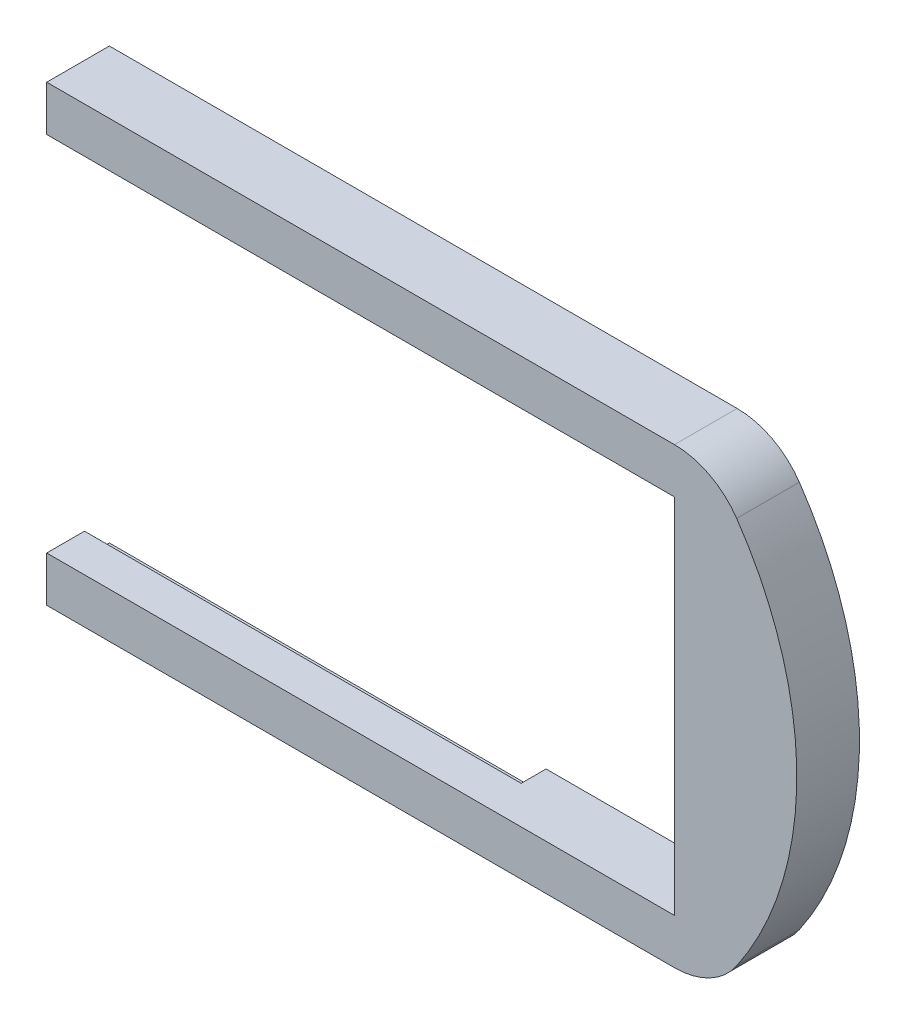
ISO-10303-21;
HEADER;
FILE_DESCRIPTION(('STEP AP214'),'2;1');
FILE_NAME('part.step','',(''),(''),'','','');
FILE_SCHEMA(('AUTOMOTIVE_DESIGN { 1 0 10303 214 1 1 1 1 }'));
ENDSEC;
DATA;
#1=APPLICATION_CONTEXT('core data for automotive mechanical design processes');
#2=APPLICATION_PROTOCOL_DEFINITION('international standard','automotive_design',2000,#1);
#3=PRODUCT_CONTEXT('',#1,'mechanical');
#4=PRODUCT('Part','Part','',(#3));
#5=PRODUCT_RELATED_PRODUCT_CATEGORY('part','',(#4));
#6=PRODUCT_DEFINITION_FORMATION('','',#4);
#7=PRODUCT_DEFINITION_CONTEXT('part definition',#1,'design');
#8=PRODUCT_DEFINITION('design','',#6,#7);
#9=PRODUCT_DEFINITION_SHAPE('','',#8);
#10=(LENGTH_UNIT() NAMED_UNIT(*) SI_UNIT(.MILLI.,.METRE.));
#11=(NAMED_UNIT(*) PLANE_ANGLE_UNIT() SI_UNIT($,.RADIAN.));
#12=(NAMED_UNIT(*) SI_UNIT($,.STERADIAN.) SOLID_ANGLE_UNIT());
#13=UNCERTAINTY_MEASURE_WITH_UNIT(LENGTH_MEASURE(1.E-05),#10,'distance_accuracy_value','');
#14=(GEOMETRIC_REPRESENTATION_CONTEXT(3) GLOBAL_UNCERTAINTY_ASSIGNED_CONTEXT((#13)) GLOBAL_UNIT_ASSIGNED_CONTEXT((#10,
#11,#12)) REPRESENTATION_CONTEXT('',''));
#15=CARTESIAN_POINT('',(0.,0.,0.));
#16=DIRECTION('',(0.,0.,1.));
#17=DIRECTION('',(1.,0.,0.));
#18=AXIS2_PLACEMENT_3D('',#15,#16,#17);
#19=CARTESIAN_POINT('',(33.9677102210414,-19.5410401503121,3.3));
#20=DIRECTION('',(0.,0.,-1.));
#21=DIRECTION('',(-1.,0.,0.));
#22=AXIS2_PLACEMENT_3D('',#19,#20,#21);
#23=CYLINDRICAL_SURFACE('',#22,7.);
#24=CARTESIAN_POINT('',(33.9677102210414,-19.5410401503121,0.));
#25=DIRECTION('',(0.,0.,1.));
#26=DIRECTION('',(1.,0.,0.));
#27=AXIS2_PLACEMENT_3D('',#24,#25,#26);
#28=CIRCLE('',#27,7.);
#29=CARTESIAN_POINT('',(39.7122728675794,-23.5410401503121,0.));
#30=VERTEX_POINT('',#29);
#31=CARTESIAN_POINT('',(39.7391199723163,-23.5022053176447,0.));
#32=VERTEX_POINT('',#31);
#33=EDGE_CURVE('E241',#30,#32,#28,.T.);
#34=ORIENTED_EDGE('',*,*,#33,.F.);
#35=DIRECTION('',(0.,0.,-1.));
#36=VECTOR('',#35,1.);
#37=CARTESIAN_POINT('',(39.7122728675794,-23.5410401503121,3.3));
#38=LINE('',#37,#36);
#39=CARTESIAN_POINT('',(39.7122728675794,-23.5410401503121,3.3));
#40=VERTEX_POINT('',#39);
#41=EDGE_CURVE('E39',#40,#30,#38,.T.);
#42=ORIENTED_EDGE('',*,*,#41,.F.);
#43=CARTESIAN_POINT('',(33.9677102210414,-19.5410401503121,3.3));
#44=DIRECTION('',(0.,0.,1.));
#45=DIRECTION('',(1.,0.,0.));
#46=AXIS2_PLACEMENT_3D('',#43,#44,#45);
#47=CIRCLE('',#46,7.);
#48=CARTESIAN_POINT('',(39.7391199723163,-23.5022053176447,3.3));
#49=VERTEX_POINT('',#48);
#50=EDGE_CURVE('E242',#40,#49,#47,.T.);
#51=ORIENTED_EDGE('',*,*,#50,.T.);
#52=DIRECTION('',(0.,0.,-1.));
#53=VECTOR('',#52,1.);
#54=CARTESIAN_POINT('',(39.7391199723163,-23.5022053176447,3.3));
#55=LINE('',#54,#53);
#56=EDGE_CURVE('E266',#49,#32,#55,.T.);
#57=ORIENTED_EDGE('',*,*,#56,.T.);
#58=EDGE_LOOP('',(#34,#42,#51,#57));
#59=FACE_BOUND('',#58,.T.);
#60=ADVANCED_FACE('F36',(#59),#23,.F.);
#61=CARTESIAN_POINT('',(0.,-23.5410401503121,3.3));
#62=DIRECTION('',(0.,1.,0.));
#63=DIRECTION('',(0.,0.,1.));
#64=AXIS2_PLACEMENT_3D('',#61,#62,#63);
#65=PLANE('',#64);
#66=DIRECTION('',(1.,0.,0.));
#67=VECTOR('',#66,1.);
#68=CARTESIAN_POINT('',(0.,-23.5410401503121,0.));
#69=LINE('',#68,#67);
#70=CARTESIAN_POINT('',(8.66771022104141,-23.5410401503121,0.));
#71=VERTEX_POINT('',#70);
#72=EDGE_CURVE('E269',#71,#30,#69,.T.);
#73=ORIENTED_EDGE('',*,*,#72,.F.);
#74=DIRECTION('',(0.,0.,-1.));
#75=VECTOR('',#74,1.);
#76=CARTESIAN_POINT('',(8.66771022104141,-23.5410401503121,3.3));
#77=LINE('',#76,#75);
#78=CARTESIAN_POINT('',(8.66771022104141,-23.5410401503121,3.3));
#79=VERTEX_POINT('',#78);
#80=EDGE_CURVE('E327',#79,#71,#77,.T.);
#81=ORIENTED_EDGE('',*,*,#80,.F.);
#82=DIRECTION('',(-1.,0.,0.));
#83=VECTOR('',#82,1.);
#84=CARTESIAN_POINT('',(0.,-23.5410401503121,3.3));
#85=LINE('',#84,#83);
#86=CARTESIAN_POINT('',(-49.1722499041823,-23.5410401503121,3.3));
#87=VERTEX_POINT('',#86);
#88=EDGE_CURVE('E199',#79,#87,#85,.T.);
#89=ORIENTED_EDGE('',*,*,#88,.T.);
#90=DIRECTION('',(0.,0.,-1.));
#91=VECTOR('',#90,1.);
#92=CARTESIAN_POINT('',(-49.1722499041823,-23.5410401503121,8.3));
#93=LINE('',#92,#91);
#94=CARTESIAN_POINT('',(-49.1722499041823,-23.5410401503121,8.3));
#95=VERTEX_POINT('',#94);
#96=EDGE_CURVE('E221',#95,#87,#93,.T.);
#97=ORIENTED_EDGE('',*,*,#96,.F.);
#98=DIRECTION('',(-1.,0.,0.));
#99=VECTOR('',#98,1.);
#100=CARTESIAN_POINT('',(0.,-23.5410401503121,8.3));
#101=LINE('',#100,#99);
#102=CARTESIAN_POINT('',(33.9677102210414,-23.5410401503121,8.3));
#103=VERTEX_POINT('',#102);
#104=EDGE_CURVE('E197',#103,#95,#101,.T.);
#105=ORIENTED_EDGE('',*,*,#104,.F.);
#106=DIRECTION('',(0.,0.,-1.));
#107=VECTOR('',#106,1.);
#108=CARTESIAN_POINT('',(33.9677102210414,-23.5410401503121,8.3));
#109=LINE('',#108,#107);
#110=CARTESIAN_POINT('',(33.9677102210414,-23.5410401503121,3.3));
#111=VERTEX_POINT('',#110);
#112=EDGE_CURVE('E232',#103,#111,#109,.T.);
#113=ORIENTED_EDGE('',*,*,#112,.T.);
#114=DIRECTION('',(1.,0.,0.));
#115=VECTOR('',#114,1.);
#116=CARTESIAN_POINT('',(0.,-23.5410401503121,3.3));
#117=LINE('',#116,#115);
#118=EDGE_CURVE('E245',#111,#40,#117,.T.);
#119=ORIENTED_EDGE('',*,*,#118,.T.);
#120=ORIENTED_EDGE('',*,*,#41,.T.);
#121=EDGE_LOOP('',(#73,#81,#89,#97,#105,#113,#119,#120));
#122=FACE_BOUND('',#121,.T.);
#123=ADVANCED_FACE('F335',(#122),#65,.T.);
#124=CARTESIAN_POINT('',(8.66771022104141,0.,3.3));
#125=DIRECTION('',(1.,0.,0.));
#126=DIRECTION('',(0.,0.,-1.));
#127=AXIS2_PLACEMENT_3D('',#124,#125,#126);
#128=PLANE('',#127);
#129=DIRECTION('',(0.,-1.,0.));
#130=VECTOR('',#129,1.);
#131=CARTESIAN_POINT('',(8.66771022104141,0.,0.));
#132=LINE('',#131,#130);
#133=CARTESIAN_POINT('',(8.66771022104141,-26.5410401503121,0.));
#134=VERTEX_POINT('',#133);
#135=EDGE_CURVE('E272',#71,#134,#132,.T.);
#136=ORIENTED_EDGE('',*,*,#135,.T.);
#137=DIRECTION('',(0.,0.,-1.));
#138=VECTOR('',#137,1.);
#139=CARTESIAN_POINT('',(8.66771022104141,-26.5410401503121,3.3));
#140=LINE('',#139,#138);
#141=CARTESIAN_POINT('',(8.66771022104141,-26.5410401503121,3.3));
#142=VERTEX_POINT('',#141);
#143=EDGE_CURVE('E326',#142,#134,#140,.T.);
#144=ORIENTED_EDGE('',*,*,#143,.F.);
#145=DIRECTION('',(0.,-1.,0.));
#146=VECTOR('',#145,1.);
#147=CARTESIAN_POINT('',(8.66771022104141,0.,3.3));
#148=LINE('',#147,#146);
#149=EDGE_CURVE('E248',#79,#142,#148,.T.);
#150=ORIENTED_EDGE('',*,*,#149,.F.);
#151=ORIENTED_EDGE('',*,*,#80,.T.);
#152=EDGE_LOOP('',(#136,#144,#150,#151));
#153=FACE_BOUND('',#152,.T.);
#154=ADVANCED_FACE('F342',(#153),#128,.F.);
#155=CARTESIAN_POINT('',(0.,-26.5410401503121,3.3));
#156=DIRECTION('',(0.,1.,0.));
#157=DIRECTION('',(0.,0.,1.));
#158=AXIS2_PLACEMENT_3D('',#155,#156,#157);
#159=PLANE('',#158);
#160=DIRECTION('',(1.,0.,0.));
#161=VECTOR('',#160,1.);
#162=CARTESIAN_POINT('',(0.,-26.5410401503121,0.));
#163=LINE('',#162,#161);
#164=CARTESIAN_POINT('',(-49.1722499041823,-26.5410401503121,0.));
#165=VERTEX_POINT('',#164);
#166=EDGE_CURVE('E275',#165,#134,#163,.T.);
#167=ORIENTED_EDGE('',*,*,#166,.F.);
#168=DIRECTION('',(0.,0.,-1.));
#169=VECTOR('',#168,1.);
#170=CARTESIAN_POINT('',(-49.1722499041823,-26.5410401503121,3.3));
#171=LINE('',#170,#169);
#172=CARTESIAN_POINT('',(-49.1722499041823,-26.5410401503121,3.3));
#173=VERTEX_POINT('',#172);
#174=EDGE_CURVE('E183',#173,#165,#171,.T.);
#175=ORIENTED_EDGE('',*,*,#174,.F.);
#176=DIRECTION('',(1.,0.,0.));
#177=VECTOR('',#176,1.);
#178=CARTESIAN_POINT('',(0.,-26.5410401503121,3.3));
#179=LINE('',#178,#177);
#180=EDGE_CURVE('E251',#173,#142,#179,.T.);
#181=ORIENTED_EDGE('',*,*,#180,.T.);
#182=ORIENTED_EDGE('',*,*,#143,.T.);
#183=EDGE_LOOP('',(#167,#175,#181,#182));
#184=FACE_BOUND('',#183,.T.);
#185=ADVANCED_FACE('F346',(#184),#159,.T.);
#186=CARTESIAN_POINT('',(-49.1722499041823,0.,3.3));
#187=DIRECTION('',(-1.,0.,0.));
#188=DIRECTION('',(0.,0.,1.));
#189=AXIS2_PLACEMENT_3D('',#186,#187,#188);
#190=PLANE('',#189);
#191=DIRECTION('',(0.,1.,0.));
#192=VECTOR('',#191,1.);
#193=CARTESIAN_POINT('',(-49.1722499041823,0.,0.));
#194=LINE('',#193,#192);
#195=CARTESIAN_POINT('',(-49.1722499041823,-29.5410401503121,0.));
#196=VERTEX_POINT('',#195);
#197=EDGE_CURVE('E180',#196,#165,#194,.T.);
#198=ORIENTED_EDGE('',*,*,#197,.F.);
#199=DIRECTION('',(0.,0.,-1.));
#200=VECTOR('',#199,1.);
#201=CARTESIAN_POINT('',(-49.1722499041823,-29.5410401503121,3.3));
#202=LINE('',#201,#200);
#203=CARTESIAN_POINT('',(-49.1722499041823,-29.5410401503121,8.3));
#204=VERTEX_POINT('',#203);
#205=EDGE_CURVE('E173',#204,#196,#202,.T.);
#206=ORIENTED_EDGE('',*,*,#205,.F.);
#207=DIRECTION('',(0.,-1.,0.));
#208=VECTOR('',#207,1.);
#209=CARTESIAN_POINT('',(-49.1722499041823,0.,8.3));
#210=LINE('',#209,#208);
#211=EDGE_CURVE('E178',#95,#204,#210,.T.);
#212=ORIENTED_EDGE('',*,*,#211,.F.);
#213=ORIENTED_EDGE('',*,*,#96,.T.);
#214=DIRECTION('',(0.,-1.,0.));
#215=VECTOR('',#214,1.);
#216=CARTESIAN_POINT('',(-49.1722499041823,0.,3.3));
#217=LINE('',#216,#215);
#218=EDGE_CURVE('E222',#87,#173,#217,.T.);
#219=ORIENTED_EDGE('',*,*,#218,.T.);
#220=ORIENTED_EDGE('',*,*,#174,.T.);
#221=EDGE_LOOP('',(#198,#206,#212,#213,#219,#220));
#222=FACE_BOUND('',#221,.T.);
#223=ADVANCED_FACE('F175',(#222),#190,.T.);
#224=CARTESIAN_POINT('',(0.,-29.5410401503121,3.3));
#225=DIRECTION('',(0.,1.,0.));
#226=DIRECTION('',(0.,0.,1.));
#227=AXIS2_PLACEMENT_3D('',#224,#225,#226);
#228=PLANE('',#227);
#229=DIRECTION('',(1.,0.,0.));
#230=VECTOR('',#229,1.);
#231=CARTESIAN_POINT('',(0.,-29.5410401503121,0.));
#232=LINE('',#231,#230);
#233=CARTESIAN_POINT('',(33.9677102210414,-29.5410401503121,0.));
#234=VERTEX_POINT('',#233);
#235=EDGE_CURVE('E279',#196,#234,#232,.T.);
#236=ORIENTED_EDGE('',*,*,#235,.T.);
#237=DIRECTION('',(0.,0.,-1.));
#238=VECTOR('',#237,1.);
#239=CARTESIAN_POINT('',(33.9677102210414,-29.5410401503121,3.3));
#240=LINE('',#239,#238);
#241=CARTESIAN_POINT('',(33.9677102210414,-29.5410401503121,8.3));
#242=VERTEX_POINT('',#241);
#243=EDGE_CURVE('E184',#242,#234,#240,.T.);
#244=ORIENTED_EDGE('',*,*,#243,.F.);
#245=DIRECTION('',(1.,0.,0.));
#246=VECTOR('',#245,1.);
#247=CARTESIAN_POINT('',(0.,-29.5410401503121,8.3));
#248=LINE('',#247,#246);
#249=EDGE_CURVE('E187',#204,#242,#248,.T.);
#250=ORIENTED_EDGE('',*,*,#249,.F.);
#251=ORIENTED_EDGE('',*,*,#205,.T.);
#252=EDGE_LOOP('',(#236,#244,#250,#251));
#253=FACE_BOUND('',#252,.T.);
#254=ADVANCED_FACE('F188',(#253),#228,.F.);
#255=CARTESIAN_POINT('',(33.9677102210414,-19.5410401503121,3.3));
#256=DIRECTION('',(0.,0.,-1.));
#257=DIRECTION('',(-1.,0.,0.));
#258=AXIS2_PLACEMENT_3D('',#255,#256,#257);
#259=CYLINDRICAL_SURFACE('',#258,10.);
#260=CARTESIAN_POINT('',(33.9677102210414,-19.5410401503121,0.));
#261=DIRECTION('',(0.,0.,1.));
#262=DIRECTION('',(1.,0.,0.));
#263=AXIS2_PLACEMENT_3D('',#260,#261,#262);
#264=CIRCLE('',#263,10.);
#265=CARTESIAN_POINT('',(42.2125812942912,-25.1998475322158,0.));
#266=VERTEX_POINT('',#265);
#267=EDGE_CURVE('E281',#234,#266,#264,.T.);
#268=ORIENTED_EDGE('',*,*,#267,.T.);
#269=DIRECTION('',(0.,0.,-1.));
#270=VECTOR('',#269,1.);
#271=CARTESIAN_POINT('',(42.2125812942912,-25.1998475322158,3.3));
#272=LINE('',#271,#270);
#273=CARTESIAN_POINT('',(42.2125812942912,-25.1998475322158,8.3));
#274=VERTEX_POINT('',#273);
#275=EDGE_CURVE('E321',#274,#266,#272,.T.);
#276=ORIENTED_EDGE('',*,*,#275,.F.);
#277=CARTESIAN_POINT('',(33.9677102210414,-19.5410401503121,8.3));
#278=DIRECTION('',(0.,0.,1.));
#279=DIRECTION('',(1.,0.,0.));
#280=AXIS2_PLACEMENT_3D('',#277,#278,#279);
#281=CIRCLE('',#280,10.);
#282=EDGE_CURVE('E193',#242,#274,#281,.T.);
#283=ORIENTED_EDGE('',*,*,#282,.F.);
#284=ORIENTED_EDGE('',*,*,#243,.T.);
#285=EDGE_LOOP('',(#268,#276,#283,#284));
#286=FACE_BOUND('',#285,.T.);
#287=ADVANCED_FACE('F353',(#286),#259,.T.);
#288=CARTESIAN_POINT('',(4.82775009581767,0.458959849687912,3.3));
#289=DIRECTION('',(0.,0.,-1.));
#290=DIRECTION('',(-1.,0.,0.));
#291=AXIS2_PLACEMENT_3D('',#288,#289,#290);
#292=CYLINDRICAL_SURFACE('',#291,45.3431361950185);
#293=CARTESIAN_POINT('',(4.82775009581767,0.458959849687912,0.));
#294=DIRECTION('',(0.,0.,1.));
#295=DIRECTION('',(1.,0.,0.));
#296=AXIS2_PLACEMENT_3D('',#293,#294,#295);
#297=CIRCLE('',#296,45.3431361950185);
#298=CARTESIAN_POINT('',(42.2125812942913,26.1177672315916,0.));
#299=VERTEX_POINT('',#298);
#300=EDGE_CURVE('E283',#266,#299,#297,.T.);
#301=ORIENTED_EDGE('',*,*,#300,.T.);
#302=DIRECTION('',(0.,0.,-1.));
#303=VECTOR('',#302,1.);
#304=CARTESIAN_POINT('',(42.2125812942913,26.1177672315916,3.3));
#305=LINE('',#304,#303);
#306=CARTESIAN_POINT('',(42.2125812942912,26.1177672315916,8.3));
#307=VERTEX_POINT('',#306);
#308=EDGE_CURVE('E318',#307,#299,#305,.T.);
#309=ORIENTED_EDGE('',*,*,#308,.F.);
#310=CARTESIAN_POINT('',(4.82775009581767,0.458959849687912,8.3));
#311=DIRECTION('',(0.,0.,1.));
#312=DIRECTION('',(1.,0.,0.));
#313=AXIS2_PLACEMENT_3D('',#310,#311,#312);
#314=CIRCLE('',#313,45.3431361950185);
#315=EDGE_CURVE('E205',#274,#307,#314,.T.);
#316=ORIENTED_EDGE('',*,*,#315,.F.);
#317=ORIENTED_EDGE('',*,*,#275,.T.);
#318=EDGE_LOOP('',(#301,#309,#316,#317));
#319=FACE_BOUND('',#318,.T.);
#320=ADVANCED_FACE('F357',(#319),#292,.T.);
#321=CARTESIAN_POINT('',(33.9677102210414,20.4589598496879,3.3));
#322=DIRECTION('',(0.,0.,-1.));
#323=DIRECTION('',(-1.,0.,0.));
#324=AXIS2_PLACEMENT_3D('',#321,#322,#323);
#325=CYLINDRICAL_SURFACE('',#324,10.);
#326=CARTESIAN_POINT('',(33.9677102210414,20.4589598496879,0.));
#327=DIRECTION('',(0.,0.,1.));
#328=DIRECTION('',(1.,0.,0.));
#329=AXIS2_PLACEMENT_3D('',#326,#327,#328);
#330=CIRCLE('',#329,10.);
#331=CARTESIAN_POINT('',(33.9677102210414,30.4589598496879,0.));
#332=VERTEX_POINT('',#331);
#333=EDGE_CURVE('E285',#299,#332,#330,.T.);
#334=ORIENTED_EDGE('',*,*,#333,.T.);
#335=DIRECTION('',(0.,0.,-1.));
#336=VECTOR('',#335,1.);
#337=CARTESIAN_POINT('',(33.9677102210414,30.4589598496879,3.3));
#338=LINE('',#337,#336);
#339=CARTESIAN_POINT('',(33.9677102210414,30.4589598496879,8.3));
#340=VERTEX_POINT('',#339);
#341=EDGE_CURVE('E315',#340,#332,#338,.T.);
#342=ORIENTED_EDGE('',*,*,#341,.F.);
#343=CARTESIAN_POINT('',(33.9677102210414,20.4589598496879,8.3));
#344=DIRECTION('',(0.,0.,1.));
#345=DIRECTION('',(1.,0.,0.));
#346=AXIS2_PLACEMENT_3D('',#343,#344,#345);
#347=CIRCLE('',#346,10.);
#348=EDGE_CURVE('E208',#307,#340,#347,.T.);
#349=ORIENTED_EDGE('',*,*,#348,.F.);
#350=ORIENTED_EDGE('',*,*,#308,.T.);
#351=EDGE_LOOP('',(#334,#342,#349,#350));
#352=FACE_BOUND('',#351,.T.);
#353=ADVANCED_FACE('F360',(#352),#325,.T.);
#354=CARTESIAN_POINT('',(0.,30.4589598496879,3.3));
#355=DIRECTION('',(0.,-1.,0.));
#356=DIRECTION('',(1.,0.,0.));
#357=AXIS2_PLACEMENT_3D('',#354,#355,#356);
#358=PLANE('',#357);
#359=DIRECTION('',(-1.,0.,0.));
#360=VECTOR('',#359,1.);
#361=CARTESIAN_POINT('',(0.,30.4589598496879,0.));
#362=LINE('',#361,#360);
#363=CARTESIAN_POINT('',(-49.1722499041823,30.4589598496879,0.));
#364=VERTEX_POINT('',#363);
#365=EDGE_CURVE('E287',#332,#364,#362,.T.);
#366=ORIENTED_EDGE('',*,*,#365,.T.);
#367=DIRECTION('',(0.,0.,-1.));
#368=VECTOR('',#367,1.);
#369=CARTESIAN_POINT('',(-49.1722499041823,30.4589598496879,3.3));
#370=LINE('',#369,#368);
#371=CARTESIAN_POINT('',(-49.1722499041823,30.4589598496879,8.3));
#372=VERTEX_POINT('',#371);
#373=EDGE_CURVE('E312',#372,#364,#370,.T.);
#374=ORIENTED_EDGE('',*,*,#373,.F.);
#375=DIRECTION('',(-1.,0.,0.));
#376=VECTOR('',#375,1.);
#377=CARTESIAN_POINT('',(0.,30.4589598496879,8.3));
#378=LINE('',#377,#376);
#379=EDGE_CURVE('E211',#340,#372,#378,.T.);
#380=ORIENTED_EDGE('',*,*,#379,.F.);
#381=ORIENTED_EDGE('',*,*,#341,.T.);
#382=EDGE_LOOP('',(#366,#374,#380,#381));
#383=FACE_BOUND('',#382,.T.);
#384=ADVANCED_FACE('F364',(#383),#358,.F.);
#385=CARTESIAN_POINT('',(-49.1722499041823,0.,3.3));
#386=DIRECTION('',(1.,0.,0.));
#387=DIRECTION('',(0.,0.,-1.));
#388=AXIS2_PLACEMENT_3D('',#385,#386,#387);
#389=PLANE('',#388);
#390=DIRECTION('',(0.,-1.,0.));
#391=VECTOR('',#390,1.);
#392=CARTESIAN_POINT('',(-49.1722499041823,0.,0.));
#393=LINE('',#392,#391);
#394=CARTESIAN_POINT('',(-49.1722499041823,27.4589598496879,0.));
#395=VERTEX_POINT('',#394);
#396=EDGE_CURVE('E289',#364,#395,#393,.T.);
#397=ORIENTED_EDGE('',*,*,#396,.T.);
#398=DIRECTION('',(0.,0.,-1.));
#399=VECTOR('',#398,1.);
#400=CARTESIAN_POINT('',(-49.1722499041823,27.4589598496879,3.3));
#401=LINE('',#400,#399);
#402=CARTESIAN_POINT('',(-49.1722499041823,27.4589598496879,3.3));
#403=VERTEX_POINT('',#402);
#404=EDGE_CURVE('E310',#403,#395,#401,.T.);
#405=ORIENTED_EDGE('',*,*,#404,.F.);
#406=DIRECTION('',(0.,-1.,0.));
#407=VECTOR('',#406,1.);
#408=CARTESIAN_POINT('',(-49.1722499041823,0.,3.3));
#409=LINE('',#408,#407);
#410=CARTESIAN_POINT('',(-49.1722499041823,24.4589598496879,3.3));
#411=VERTEX_POINT('',#410);
#412=EDGE_CURVE('E225',#403,#411,#409,.T.);
#413=ORIENTED_EDGE('',*,*,#412,.T.);
#414=DIRECTION('',(0.,0.,-1.));
#415=VECTOR('',#414,1.);
#416=CARTESIAN_POINT('',(-49.1722499041823,24.4589598496879,8.3));
#417=LINE('',#416,#415);
#418=CARTESIAN_POINT('',(-49.1722499041823,24.4589598496879,8.3));
#419=VERTEX_POINT('',#418);
#420=EDGE_CURVE('E238',#419,#411,#417,.T.);
#421=ORIENTED_EDGE('',*,*,#420,.F.);
#422=DIRECTION('',(0.,-1.,0.));
#423=VECTOR('',#422,1.);
#424=CARTESIAN_POINT('',(-49.1722499041823,0.,8.3));
#425=LINE('',#424,#423);
#426=EDGE_CURVE('E214',#372,#419,#425,.T.);
#427=ORIENTED_EDGE('',*,*,#426,.F.);
#428=ORIENTED_EDGE('',*,*,#373,.T.);
#429=EDGE_LOOP('',(#397,#405,#413,#421,#427,#428));
#430=FACE_BOUND('',#429,.T.);
#431=ADVANCED_FACE('F368',(#430),#389,.F.);
#432=CARTESIAN_POINT('',(0.,27.4589598496879,3.3));
#433=DIRECTION('',(0.,-1.,0.));
#434=DIRECTION('',(0.,0.,-1.));
#435=AXIS2_PLACEMENT_3D('',#432,#433,#434);
#436=PLANE('',#435);
#437=DIRECTION('',(-1.,0.,0.));
#438=VECTOR('',#437,1.);
#439=CARTESIAN_POINT('',(0.,27.4589598496879,0.));
#440=LINE('',#439,#438);
#441=CARTESIAN_POINT('',(8.66771022104141,27.4589598496879,0.));
#442=VERTEX_POINT('',#441);
#443=EDGE_CURVE('E292',#442,#395,#440,.T.);
#444=ORIENTED_EDGE('',*,*,#443,.F.);
#445=DIRECTION('',(0.,0.,-1.));
#446=VECTOR('',#445,1.);
#447=CARTESIAN_POINT('',(8.66771022104141,27.4589598496879,3.3));
#448=LINE('',#447,#446);
#449=CARTESIAN_POINT('',(8.66771022104141,27.4589598496879,3.3));
#450=VERTEX_POINT('',#449);
#451=EDGE_CURVE('E308',#450,#442,#448,.T.);
#452=ORIENTED_EDGE('',*,*,#451,.F.);
#453=DIRECTION('',(-1.,0.,0.));
#454=VECTOR('',#453,1.);
#455=CARTESIAN_POINT('',(0.,27.4589598496879,3.3));
#456=LINE('',#455,#454);
#457=EDGE_CURVE('E254',#450,#403,#456,.T.);
#458=ORIENTED_EDGE('',*,*,#457,.T.);
#459=ORIENTED_EDGE('',*,*,#404,.T.);
#460=EDGE_LOOP('',(#444,#452,#458,#459));
#461=FACE_BOUND('',#460,.T.);
#462=ADVANCED_FACE('F395',(#461),#436,.T.);
#463=CARTESIAN_POINT('',(8.66771022104139,0.,3.3));
#464=DIRECTION('',(1.,0.,0.));
#465=DIRECTION('',(0.,1.,0.));
#466=AXIS2_PLACEMENT_3D('',#463,#464,#465);
#467=PLANE('',#466);
#468=DIRECTION('',(0.,-1.,0.));
#469=VECTOR('',#468,1.);
#470=CARTESIAN_POINT('',(8.66771022104139,0.,0.));
#471=LINE('',#470,#469);
#472=CARTESIAN_POINT('',(8.6677102210414,24.4201250170205,0.));
#473=VERTEX_POINT('',#472);
#474=EDGE_CURVE('E295',#442,#473,#471,.T.);
#475=ORIENTED_EDGE('',*,*,#474,.T.);
#476=DIRECTION('',(0.,0.,-1.));
#477=VECTOR('',#476,1.);
#478=CARTESIAN_POINT('',(8.6677102210414,24.4201250170205,3.3));
#479=LINE('',#478,#477);
#480=CARTESIAN_POINT('',(8.6677102210414,24.4201250170205,3.3));
#481=VERTEX_POINT('',#480);
#482=EDGE_CURVE('E305',#481,#473,#479,.T.);
#483=ORIENTED_EDGE('',*,*,#482,.F.);
#484=DIRECTION('',(0.,-1.,0.));
#485=VECTOR('',#484,1.);
#486=CARTESIAN_POINT('',(8.66771022104139,0.,3.3));
#487=LINE('',#486,#485);
#488=CARTESIAN_POINT('',(8.6677102210414,24.4589598496879,3.3));
#489=VERTEX_POINT('',#488);
#490=EDGE_CURVE('E257',#489,#481,#487,.T.);
#491=ORIENTED_EDGE('',*,*,#490,.F.);
#492=EDGE_CURVE('E258',#450,#489,#487,.T.);
#493=ORIENTED_EDGE('',*,*,#492,.F.);
#494=ORIENTED_EDGE('',*,*,#451,.T.);
#495=EDGE_LOOP('',(#475,#483,#491,#493,#494));
#496=FACE_BOUND('',#495,.T.);
#497=ADVANCED_FACE('F391',(#496),#467,.F.);
#498=CARTESIAN_POINT('',(0.,24.4201250170205,3.3));
#499=DIRECTION('',(0.,1.,0.));
#500=DIRECTION('',(0.,0.,1.));
#501=AXIS2_PLACEMENT_3D('',#498,#499,#500);
#502=PLANE('',#501);
#503=DIRECTION('',(1.,0.,0.));
#504=VECTOR('',#503,1.);
#505=CARTESIAN_POINT('',(0.,24.4201250170205,0.));
#506=LINE('',#505,#504);
#507=CARTESIAN_POINT('',(39.7391199723163,24.4201250170205,0.));
#508=VERTEX_POINT('',#507);
#509=EDGE_CURVE('E297',#473,#508,#506,.T.);
#510=ORIENTED_EDGE('',*,*,#509,.T.);
#511=DIRECTION('',(0.,0.,-1.));
#512=VECTOR('',#511,1.);
#513=CARTESIAN_POINT('',(39.7391199723163,24.4201250170205,3.3));
#514=LINE('',#513,#512);
#515=CARTESIAN_POINT('',(39.7391199723163,24.4201250170205,3.3));
#516=VERTEX_POINT('',#515);
#517=EDGE_CURVE('E302',#516,#508,#514,.T.);
#518=ORIENTED_EDGE('',*,*,#517,.F.);
#519=DIRECTION('',(1.,0.,0.));
#520=VECTOR('',#519,1.);
#521=CARTESIAN_POINT('',(0.,24.4201250170205,3.3));
#522=LINE('',#521,#520);
#523=CARTESIAN_POINT('',(33.9677102210414,24.4201250170205,3.3));
#524=VERTEX_POINT('',#523);
#525=EDGE_CURVE('E52',#524,#516,#522,.T.);
#526=ORIENTED_EDGE('',*,*,#525,.F.);
#527=EDGE_CURVE('E261',#481,#524,#522,.T.);
#528=ORIENTED_EDGE('',*,*,#527,.F.);
#529=ORIENTED_EDGE('',*,*,#482,.T.);
#530=EDGE_LOOP('',(#510,#518,#526,#528,#529));
#531=FACE_BOUND('',#530,.T.);
#532=ADVANCED_FACE('F388',(#531),#502,.F.);
#533=CARTESIAN_POINT('',(39.7391199723163,0.,3.3));
#534=DIRECTION('',(1.,0.,0.));
#535=DIRECTION('',(0.,1.,0.));
#536=AXIS2_PLACEMENT_3D('',#533,#534,#535);
#537=PLANE('',#536);
#538=DIRECTION('',(0.,-1.,0.));
#539=VECTOR('',#538,1.);
#540=CARTESIAN_POINT('',(39.7391199723163,0.,0.));
#541=LINE('',#540,#539);
#542=EDGE_CURVE('E246',#508,#32,#541,.T.);
#543=ORIENTED_EDGE('',*,*,#542,.T.);
#544=ORIENTED_EDGE('',*,*,#56,.F.);
#545=DIRECTION('',(0.,-1.,0.));
#546=VECTOR('',#545,1.);
#547=CARTESIAN_POINT('',(39.7391199723163,0.,3.3));
#548=LINE('',#547,#546);
#549=EDGE_CURVE('E263',#516,#49,#548,.T.);
#550=ORIENTED_EDGE('',*,*,#549,.F.);
#551=ORIENTED_EDGE('',*,*,#517,.T.);
#552=EDGE_LOOP('',(#543,#544,#550,#551));
#553=FACE_BOUND('',#552,.T.);
#554=ADVANCED_FACE('F384',(#553),#537,.F.);
#555=CARTESIAN_POINT('',(0.,0.,3.3));
#556=DIRECTION('',(0.,0.,1.));
#557=DIRECTION('',(1.,0.,0.));
#558=AXIS2_PLACEMENT_3D('',#555,#556,#557);
#559=PLANE('',#558);
#560=DIRECTION('',(0.,-1.,0.));
#561=VECTOR('',#560,1.);
#562=CARTESIAN_POINT('',(33.9677102210414,0.,3.3));
#563=LINE('',#562,#561);
#564=CARTESIAN_POINT('',(33.9677102210414,24.4589598496879,3.3));
#565=VERTEX_POINT('',#564);
#566=EDGE_CURVE('E201',#565,#524,#563,.T.);
#567=ORIENTED_EDGE('',*,*,#566,.F.);
#568=DIRECTION('',(1.,0.,0.));
#569=VECTOR('',#568,1.);
#570=CARTESIAN_POINT('',(0.,24.4589598496879,3.3));
#571=LINE('',#570,#569);
#572=EDGE_CURVE('E11',#489,#565,#571,.T.);
#573=ORIENTED_EDGE('',*,*,#572,.F.);
#574=ORIENTED_EDGE('',*,*,#490,.T.);
#575=ORIENTED_EDGE('',*,*,#527,.T.);
#576=EDGE_LOOP('',(#567,#573,#574,#575));
#577=FACE_BOUND('',#576,.T.);
#578=ADVANCED_FACE('F443',(#577),#559,.T.);
#579=CARTESIAN_POINT('',(0.,0.,0.));
#580=DIRECTION('',(0.,0.,1.));
#581=DIRECTION('',(1.,0.,0.));
#582=AXIS2_PLACEMENT_3D('',#579,#580,#581);
#583=PLANE('',#582);
#584=ORIENTED_EDGE('',*,*,#33,.T.);
#585=ORIENTED_EDGE('',*,*,#542,.F.);
#586=ORIENTED_EDGE('',*,*,#509,.F.);
#587=ORIENTED_EDGE('',*,*,#474,.F.);
#588=ORIENTED_EDGE('',*,*,#443,.T.);
#589=ORIENTED_EDGE('',*,*,#396,.F.);
#590=ORIENTED_EDGE('',*,*,#365,.F.);
#591=ORIENTED_EDGE('',*,*,#333,.F.);
#592=ORIENTED_EDGE('',*,*,#300,.F.);
#593=ORIENTED_EDGE('',*,*,#267,.F.);
#594=ORIENTED_EDGE('',*,*,#235,.F.);
#595=ORIENTED_EDGE('',*,*,#197,.T.);
#596=ORIENTED_EDGE('',*,*,#166,.T.);
#597=ORIENTED_EDGE('',*,*,#135,.F.);
#598=ORIENTED_EDGE('',*,*,#72,.T.);
#599=EDGE_LOOP('',(#584,#585,#586,#587,#588,#589,#590,#591,#592,#593,#594,#595,#596,#597,#598));
#600=FACE_BOUND('',#599,.T.);
#601=ADVANCED_FACE('F340',(#600),#583,.F.);
#602=CARTESIAN_POINT('',(0.,0.,3.3));
#603=DIRECTION('',(0.,0.,1.));
#604=DIRECTION('',(1.,0.,0.));
#605=AXIS2_PLACEMENT_3D('',#602,#603,#604);
#606=PLANE('',#605);
#607=ORIENTED_EDGE('',*,*,#88,.F.);
#608=ORIENTED_EDGE('',*,*,#149,.T.);
#609=ORIENTED_EDGE('',*,*,#180,.F.);
#610=ORIENTED_EDGE('',*,*,#218,.F.);
#611=EDGE_LOOP('',(#607,#608,#609,#610));
#612=FACE_BOUND('',#611,.T.);
#613=ADVANCED_FACE('F349',(#612),#606,.F.);
#614=ORIENTED_EDGE('',*,*,#457,.F.);
#615=ORIENTED_EDGE('',*,*,#492,.T.);
#616=EDGE_CURVE('E45',#411,#489,#571,.T.);
#617=ORIENTED_EDGE('',*,*,#616,.F.);
#618=ORIENTED_EDGE('',*,*,#412,.F.);
#619=EDGE_LOOP('',(#614,#615,#617,#618));
#620=FACE_BOUND('',#619,.T.);
#621=ADVANCED_FACE('F399',(#620),#606,.F.);
#622=CARTESIAN_POINT('',(0.,24.4589598496879,8.3));
#623=DIRECTION('',(0.,1.,0.));
#624=DIRECTION('',(0.,0.,1.));
#625=AXIS2_PLACEMENT_3D('',#622,#623,#624);
#626=PLANE('',#625);
#627=ORIENTED_EDGE('',*,*,#616,.T.);
#628=ORIENTED_EDGE('',*,*,#572,.T.);
#629=DIRECTION('',(0.,0.,-1.));
#630=VECTOR('',#629,1.);
#631=CARTESIAN_POINT('',(33.9677102210414,24.4589598496879,8.3));
#632=LINE('',#631,#630);
#633=CARTESIAN_POINT('',(33.9677102210414,24.4589598496879,8.3));
#634=VERTEX_POINT('',#633);
#635=EDGE_CURVE('E235',#634,#565,#632,.T.);
#636=ORIENTED_EDGE('',*,*,#635,.F.);
#637=DIRECTION('',(1.,0.,0.));
#638=VECTOR('',#637,1.);
#639=CARTESIAN_POINT('',(0.,24.4589598496879,8.3));
#640=LINE('',#639,#638);
#641=EDGE_CURVE('E216',#419,#634,#640,.T.);
#642=ORIENTED_EDGE('',*,*,#641,.F.);
#643=ORIENTED_EDGE('',*,*,#420,.T.);
#644=EDGE_LOOP('',(#627,#628,#636,#642,#643));
#645=FACE_BOUND('',#644,.T.);
#646=ADVANCED_FACE('F375',(#645),#626,.F.);
#647=CARTESIAN_POINT('',(33.9677102210414,0.,8.3));
#648=DIRECTION('',(1.,0.,0.));
#649=DIRECTION('',(0.,0.,-1.));
#650=AXIS2_PLACEMENT_3D('',#647,#648,#649);
#651=PLANE('',#650);
#652=ORIENTED_EDGE('',*,*,#566,.T.);
#653=EDGE_CURVE('E228',#524,#111,#563,.T.);
#654=ORIENTED_EDGE('',*,*,#653,.T.);
#655=ORIENTED_EDGE('',*,*,#112,.F.);
#656=DIRECTION('',(0.,-1.,0.));
#657=VECTOR('',#656,1.);
#658=CARTESIAN_POINT('',(33.9677102210414,0.,8.3));
#659=LINE('',#658,#657);
#660=EDGE_CURVE('E218',#634,#103,#659,.T.);
#661=ORIENTED_EDGE('',*,*,#660,.F.);
#662=ORIENTED_EDGE('',*,*,#635,.T.);
#663=EDGE_LOOP('',(#652,#654,#655,#661,#662));
#664=FACE_BOUND('',#663,.T.);
#665=ADVANCED_FACE('F377',(#664),#651,.F.);
#666=CARTESIAN_POINT('',(0.,0.,8.3));
#667=DIRECTION('',(0.,0.,1.));
#668=DIRECTION('',(1.,0.,0.));
#669=AXIS2_PLACEMENT_3D('',#666,#667,#668);
#670=PLANE('',#669);
#671=ORIENTED_EDGE('',*,*,#211,.T.);
#672=ORIENTED_EDGE('',*,*,#249,.T.);
#673=ORIENTED_EDGE('',*,*,#282,.T.);
#674=ORIENTED_EDGE('',*,*,#315,.T.);
#675=ORIENTED_EDGE('',*,*,#348,.T.);
#676=ORIENTED_EDGE('',*,*,#379,.T.);
#677=ORIENTED_EDGE('',*,*,#426,.T.);
#678=ORIENTED_EDGE('',*,*,#641,.T.);
#679=ORIENTED_EDGE('',*,*,#660,.T.);
#680=ORIENTED_EDGE('',*,*,#104,.T.);
#681=EDGE_LOOP('',(#671,#672,#673,#674,#675,#676,#677,#678,#679,#680));
#682=FACE_BOUND('',#681,.T.);
#683=ADVANCED_FACE('F195',(#682),#670,.T.);
#684=ORIENTED_EDGE('',*,*,#118,.F.);
#685=ORIENTED_EDGE('',*,*,#653,.F.);
#686=ORIENTED_EDGE('',*,*,#525,.T.);
#687=ORIENTED_EDGE('',*,*,#549,.T.);
#688=ORIENTED_EDGE('',*,*,#50,.F.);
#689=EDGE_LOOP('',(#684,#685,#686,#687,#688));
#690=FACE_BOUND('',#689,.T.);
#691=ADVANCED_FACE('F381',(#690),#606,.F.);
#692=CLOSED_SHELL('',(#60,#123,#154,#185,#223,#254,#287,#320,#353,#384,#431,#462,#497,#532,#554,
#578,#601,#613,#621,#646,#665,#683,#691));
#693=MANIFOLD_SOLID_BREP('B2',#692);
#694=ADVANCED_BREP_SHAPE_REPRESENTATION('',(#18,#693),#14);
#695=SHAPE_DEFINITION_REPRESENTATION(#9,#694);
ENDSEC;
END-ISO-10303-21;
